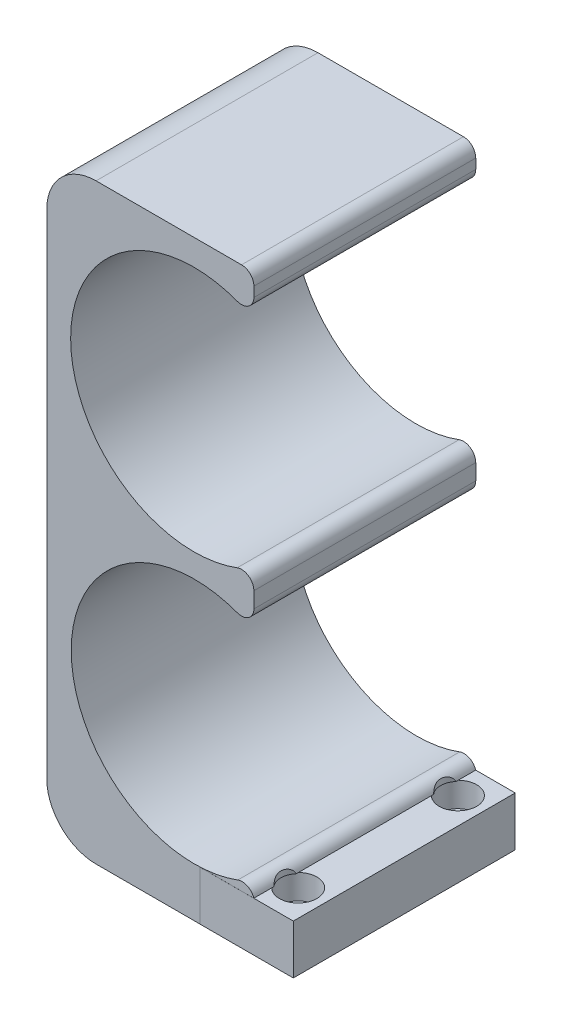
ISO-10303-21;
HEADER;
FILE_DESCRIPTION(('STEP AP214'),'2;1');
FILE_NAME('part.step','',(''),(''),'','','');
FILE_SCHEMA(('AUTOMOTIVE_DESIGN { 1 0 10303 214 1 1 1 1 }'));
ENDSEC;
DATA;
#1=APPLICATION_CONTEXT('core data for automotive mechanical design processes');
#2=APPLICATION_PROTOCOL_DEFINITION('international standard','automotive_design',2000,#1);
#3=PRODUCT_CONTEXT('',#1,'mechanical');
#4=PRODUCT('Part','Part','',(#3));
#5=PRODUCT_RELATED_PRODUCT_CATEGORY('part','',(#4));
#6=PRODUCT_DEFINITION_FORMATION('','',#4);
#7=PRODUCT_DEFINITION_CONTEXT('part definition',#1,'design');
#8=PRODUCT_DEFINITION('design','',#6,#7);
#9=PRODUCT_DEFINITION_SHAPE('','',#8);
#10=(LENGTH_UNIT() NAMED_UNIT(*) SI_UNIT(.MILLI.,.METRE.));
#11=(NAMED_UNIT(*) PLANE_ANGLE_UNIT() SI_UNIT($,.RADIAN.));
#12=(NAMED_UNIT(*) SI_UNIT($,.STERADIAN.) SOLID_ANGLE_UNIT());
#13=UNCERTAINTY_MEASURE_WITH_UNIT(LENGTH_MEASURE(1.E-05),#10,'distance_accuracy_value','');
#14=(GEOMETRIC_REPRESENTATION_CONTEXT(3) GLOBAL_UNCERTAINTY_ASSIGNED_CONTEXT((#13)) GLOBAL_UNIT_ASSIGNED_CONTEXT((#10,
#11,#12)) REPRESENTATION_CONTEXT('',''));
#15=CARTESIAN_POINT('',(0.,0.,0.));
#16=DIRECTION('',(0.,0.,1.));
#17=DIRECTION('',(1.,0.,0.));
#18=AXIS2_PLACEMENT_3D('',#15,#16,#17);
#19=CARTESIAN_POINT('',(-19.494231674002,6.35,-14.3934035007968));
#20=DIRECTION('',(0.,1.,0.));
#21=DIRECTION('',(0.,0.,1.));
#22=AXIS2_PLACEMENT_3D('',#19,#20,#21);
#23=PLANE('',#22);
#24=DIRECTION('',(0.,0.,1.));
#25=VECTOR('',#24,1.);
#26=CARTESIAN_POINT('',(-22.8725122936076,6.35,-14.3934035007968));
#27=LINE('',#26,#25);
#28=CARTESIAN_POINT('',(-22.8725122936076,6.35,-10.9470291660507));
#29=VERTEX_POINT('',#28);
#30=CARTESIAN_POINT('',(-22.8725122936077,6.35,-11.5045897208524));
#31=VERTEX_POINT('',#30);
#32=EDGE_CURVE('E124',#29,#31,#27,.F.);
#33=ORIENTED_EDGE('',*,*,#32,.F.);
#34=CARTESIAN_POINT('',(-19.494231674002,6.35,-14.3934035007968));
#35=DIRECTION('',(0.,-1.,0.));
#36=DIRECTION('',(0.,0.,-1.));
#37=AXIS2_PLACEMENT_3D('',#34,#35,#36);
#38=CIRCLE('',#37,4.826);
#39=CARTESIAN_POINT('',(-22.8725122936076,6.35,-17.8397778355429));
#40=VERTEX_POINT('',#39);
#41=EDGE_CURVE('E431',#29,#40,#38,.T.);
#42=ORIENTED_EDGE('',*,*,#41,.T.);
#43=DIRECTION('',(0.,0.,1.));
#44=VECTOR('',#43,1.);
#45=CARTESIAN_POINT('',(-22.8725122936076,6.35,-14.3934035007968));
#46=LINE('',#45,#44);
#47=CARTESIAN_POINT('',(-22.8725122936077,6.35,-17.2822172807411));
#48=VERTEX_POINT('',#47);
#49=EDGE_CURVE('E118',#48,#40,#46,.F.);
#50=ORIENTED_EDGE('',*,*,#49,.F.);
#51=CARTESIAN_POINT('',(-19.494231674002,6.35,-14.3934035007968));
#52=DIRECTION('',(0.,1.,0.));
#53=DIRECTION('',(0.,0.,1.));
#54=AXIS2_PLACEMENT_3D('',#51,#52,#53);
#55=CIRCLE('',#54,4.445);
#56=EDGE_CURVE('E19',#48,#31,#55,.T.);
#57=ORIENTED_EDGE('',*,*,#56,.T.);
#58=EDGE_LOOP('',(#33,#42,#50,#57));
#59=FACE_BOUND('',#58,.T.);
#60=ADVANCED_FACE('F16',(#59),#23,.F.);
#61=CARTESIAN_POINT('',(-19.494231674002,6.35,-55.5414035007968));
#62=DIRECTION('',(0.,1.,0.));
#63=DIRECTION('',(0.,0.,1.));
#64=AXIS2_PLACEMENT_3D('',#61,#62,#63);
#65=PLANE('',#64);
#66=DIRECTION('',(0.,0.,1.));
#67=VECTOR('',#66,1.);
#68=CARTESIAN_POINT('',(-22.8725122936076,6.35,-55.5414035007968));
#69=LINE('',#68,#67);
#70=CARTESIAN_POINT('',(-22.8725122936076,6.35,-52.0950291660506));
#71=VERTEX_POINT('',#70);
#72=CARTESIAN_POINT('',(-22.8725122936077,6.35,-52.6525897208525));
#73=VERTEX_POINT('',#72);
#74=EDGE_CURVE('E136',#71,#73,#69,.F.);
#75=ORIENTED_EDGE('',*,*,#74,.F.);
#76=CARTESIAN_POINT('',(-19.494231674002,6.35,-55.5414035007968));
#77=DIRECTION('',(0.,-1.,0.));
#78=DIRECTION('',(0.,0.,-1.));
#79=AXIS2_PLACEMENT_3D('',#76,#77,#78);
#80=CIRCLE('',#79,4.826);
#81=CARTESIAN_POINT('',(-22.8725122936076,6.35,-58.9877778355429));
#82=VERTEX_POINT('',#81);
#83=EDGE_CURVE('E436',#71,#82,#80,.T.);
#84=ORIENTED_EDGE('',*,*,#83,.T.);
#85=DIRECTION('',(0.,0.,1.));
#86=VECTOR('',#85,1.);
#87=CARTESIAN_POINT('',(-22.8725122936076,6.35,-55.5414035007968));
#88=LINE('',#87,#86);
#89=CARTESIAN_POINT('',(-22.8725122936077,6.35,-58.4302172807412));
#90=VERTEX_POINT('',#89);
#91=EDGE_CURVE('E132',#90,#82,#88,.F.);
#92=ORIENTED_EDGE('',*,*,#91,.F.);
#93=CARTESIAN_POINT('',(-19.494231674002,6.35,-55.5414035007968));
#94=DIRECTION('',(0.,1.,0.));
#95=DIRECTION('',(0.,0.,1.));
#96=AXIS2_PLACEMENT_3D('',#93,#94,#95);
#97=CIRCLE('',#96,4.445);
#98=EDGE_CURVE('E135',#90,#73,#97,.T.);
#99=ORIENTED_EDGE('',*,*,#98,.T.);
#100=EDGE_LOOP('',(#75,#84,#92,#99));
#101=FACE_BOUND('',#100,.T.);
#102=ADVANCED_FACE('F444',(#101),#65,.F.);
#103=CARTESIAN_POINT('',(-19.494231674002,0.,-55.5414035007968));
#104=DIRECTION('',(0.,1.,0.));
#105=DIRECTION('',(0.,0.,1.));
#106=AXIS2_PLACEMENT_3D('',#103,#104,#105);
#107=PLANE('',#106);
#108=CARTESIAN_POINT('',(-19.494197563237,0.,-55.5413855472897));
#109=DIRECTION('',(0.,-1.,0.));
#110=DIRECTION('',(0.,0.,-1.));
#111=AXIS2_PLACEMENT_3D('',#108,#109,#110);
#112=CIRCLE('',#111,3.1877);
#113=CARTESIAN_POINT('',(-19.494197563237,0.,-58.7290855472897));
#114=VERTEX_POINT('',#113);
#115=EDGE_CURVE('E450',#114,#114,#112,.T.);
#116=ORIENTED_EDGE('',*,*,#115,.T.);
#117=EDGE_LOOP('',(#116));
#118=FACE_BOUND('',#117,.T.);
#119=CARTESIAN_POINT('',(-19.494231674002,0.,-55.5414035007968));
#120=DIRECTION('',(0.,-1.,0.));
#121=DIRECTION('',(0.,0.,-1.));
#122=AXIS2_PLACEMENT_3D('',#119,#120,#121);
#123=CIRCLE('',#122,4.826);
#124=CARTESIAN_POINT('',(-19.494231674002,0.,-60.3674035007968));
#125=VERTEX_POINT('',#124);
#126=EDGE_CURVE('E432',#125,#125,#123,.F.);
#127=ORIENTED_EDGE('',*,*,#126,.T.);
#128=EDGE_LOOP('',(#127));
#129=FACE_BOUND('',#128,.T.);
#130=ADVANCED_FACE('F460',(#118,#129),#107,.T.);
#131=CARTESIAN_POINT('',(-19.494231674002,0.,-14.3934035007968));
#132=DIRECTION('',(0.,1.,0.));
#133=DIRECTION('',(0.,0.,1.));
#134=AXIS2_PLACEMENT_3D('',#131,#132,#133);
#135=PLANE('',#134);
#136=CARTESIAN_POINT('',(-19.494197563237,0.,-14.3933855472898));
#137=DIRECTION('',(0.,-1.,0.));
#138=DIRECTION('',(0.,0.,-1.));
#139=AXIS2_PLACEMENT_3D('',#136,#137,#138);
#140=CIRCLE('',#139,3.1877);
#141=CARTESIAN_POINT('',(-19.494197563237,0.,-17.5810855472898));
#142=VERTEX_POINT('',#141);
#143=EDGE_CURVE('E158',#142,#142,#140,.T.);
#144=ORIENTED_EDGE('',*,*,#143,.T.);
#145=EDGE_LOOP('',(#144));
#146=FACE_BOUND('',#145,.T.);
#147=CARTESIAN_POINT('',(-19.494231674002,0.,-14.3934035007968));
#148=DIRECTION('',(0.,-1.,0.));
#149=DIRECTION('',(0.,0.,-1.));
#150=AXIS2_PLACEMENT_3D('',#147,#148,#149);
#151=CIRCLE('',#150,4.826);
#152=CARTESIAN_POINT('',(-19.494231674002,0.,-19.2194035007968));
#153=VERTEX_POINT('',#152);
#154=EDGE_CURVE('E433',#153,#153,#151,.F.);
#155=ORIENTED_EDGE('',*,*,#154,.T.);
#156=EDGE_LOOP('',(#155));
#157=FACE_BOUND('',#156,.T.);
#158=ADVANCED_FACE('F236',(#146,#157),#135,.T.);
#159=CARTESIAN_POINT('',(-19.494231674002,19.05,-14.3934035007968));
#160=DIRECTION('',(0.,1.,0.));
#161=DIRECTION('',(0.,0.,1.));
#162=AXIS2_PLACEMENT_3D('',#159,#160,#161);
#163=CYLINDRICAL_SURFACE('',#162,4.445);
#164=ORIENTED_EDGE('',*,*,#56,.F.);
#165=CARTESIAN_POINT('',(-22.8725122936077,6.34999999999994,-11.5045897208525));
#166=CARTESIAN_POINT('',(-22.8920451918921,6.41147570182169,-11.5274378372141));
#167=CARTESIAN_POINT('',(-22.9132277684487,6.47152594132509,-11.5526728571365));
#168=CARTESIAN_POINT('',(-22.9583015126842,6.5883353593207,-11.6078117798077));
#169=CARTESIAN_POINT('',(-22.9821911921445,6.64509632038776,-11.6377131206435));
#170=CARTESIAN_POINT('',(-23.0319465584518,6.75459328149273,-11.7018928247726));
#171=CARTESIAN_POINT('',(-23.0577981885288,6.80735333728106,-11.7361410503486));
#172=CARTESIAN_POINT('',(-23.1109770246334,6.90896403797198,-11.8089847774471));
#173=CARTESIAN_POINT('',(-23.1383043299793,6.95781441918892,-11.8475805717667));
#174=CARTESIAN_POINT('',(-23.2214594175863,7.09804991769206,-11.969480061171));
#175=CARTESIAN_POINT('',(-23.2785745275803,7.1833603445574,-12.0590375562628));
#176=CARTESIAN_POINT('',(-23.391225622354,7.3372203885933,-12.252373934328));
#177=CARTESIAN_POINT('',(-23.446759795253,7.4057514086496,-12.3561683996259));
#178=CARTESIAN_POINT('',(-23.5543989681339,7.52960279342919,-12.5798156122773));
#179=CARTESIAN_POINT('',(-23.6062581817026,7.58423853327209,-12.7001631250538));
#180=CARTESIAN_POINT('',(-23.7005221374328,7.67823855188195,-12.9501326289187));
#181=CARTESIAN_POINT('',(-23.7429220711319,7.71759507120917,-13.0797592928835));
#182=CARTESIAN_POINT('',(-23.8225896576431,7.78877747463149,-13.368901802784));
#183=CARTESIAN_POINT('',(-23.8576334777036,7.81805121469415,-13.5296571896206));
#184=CARTESIAN_POINT('',(-23.9097483274717,7.86069960690767,-13.8561891612444));
#185=CARTESIAN_POINT('',(-23.9268088075146,7.87406492720888,-14.0219686347467));
#186=CARTESIAN_POINT('',(-23.9388807399334,7.88351654364624,-14.283135419777));
#187=CARTESIAN_POINT('',(-23.9402202597285,7.88456272383606,-14.3781243571447));
#188=CARTESIAN_POINT('',(-23.9368162228094,7.88190477450004,-14.5679548321959));
#189=CARTESIAN_POINT('',(-23.9320720753788,7.8782001836803,-14.6627963546702));
#190=CARTESIAN_POINT('',(-23.9165540024281,7.86592230892872,-14.8517581416133));
#191=CARTESIAN_POINT('',(-23.9057742574148,7.85734432597895,-14.9458776209718));
#192=CARTESIAN_POINT('',(-23.8783459868438,7.83505592136879,-15.1326413313534));
#193=CARTESIAN_POINT('',(-23.8616978446236,7.82134583494586,-15.2252856583238));
#194=CARTESIAN_POINT('',(-23.8222755857124,7.78794877758394,-15.4109025366153));
#195=CARTESIAN_POINT('',(-23.7993466150719,7.76810883309864,-15.5038149811317));
#196=CARTESIAN_POINT('',(-23.7480383646919,7.72204315139386,-15.686522861017));
#197=CARTESIAN_POINT('',(-23.7196584317083,7.69581664870736,-15.7763179212735));
#198=CARTESIAN_POINT('',(-23.6581649431002,7.63639585076365,-15.9517028430376));
#199=CARTESIAN_POINT('',(-23.6250605557926,7.60321499406476,-16.0373004276869));
#200=CARTESIAN_POINT('',(-23.5550131016321,7.52923576324314,-16.2034348491194));
#201=CARTESIAN_POINT('',(-23.5180717766961,7.48844083915671,-16.2839739559636));
#202=CARTESIAN_POINT('',(-23.4251868864897,7.37949179310147,-16.4720457961898));
#203=CARTESIAN_POINT('',(-23.3678456572501,7.30708199929274,-16.5764841851364));
#204=CARTESIAN_POINT('',(-23.2522613482505,7.14467836900094,-16.7699406802251));
#205=CARTESIAN_POINT('',(-23.194020053176,7.05471602461718,-16.8589858724278));
#206=CARTESIAN_POINT('',(-23.1128985524444,6.91224525134455,-16.9751132005434));
#207=CARTESIAN_POINT('',(-23.0882138596594,6.86640671721727,-17.0093060865139));
#208=CARTESIAN_POINT('',(-23.0402203134458,6.77150633555866,-17.0740013277948));
#209=CARTESIAN_POINT('',(-23.0169112667348,6.72244494290515,-17.104504202198));
#210=CARTESIAN_POINT('',(-22.9720283819479,6.62105992214224,-17.1618494648016));
#211=CARTESIAN_POINT('',(-22.9504648716513,6.56871972793276,-17.1886706390673));
#212=CARTESIAN_POINT('',(-22.9096448488543,6.46131717970363,-17.2384001994919));
#213=CARTESIAN_POINT('',(-22.8903894441342,6.40625353632601,-17.2613067090265));
#214=CARTESIAN_POINT('',(-22.8725122936077,6.34999999999998,-17.2822172807411));
#215=B_SPLINE_CURVE_WITH_KNOTS('',3,(#165,#166,#167,#168,#169,#170,#171,#172,#173,#174,#175,
#176,#177,#178,#179,#180,#181,#182,#183,#184,#185,#186,#187,#188,#189,#190,#191,#192,#193,#194,
#195,#196,#197,#198,#199,#200,#201,#202,#203,#204,#205,#206,#207,#208,#209,#210,#211,#212,#213,
#214),.UNSPECIFIED.,.F.,.F.,(4,2,2,2,2,2,2,2,2,2,2,2,2,2,2,2,2,2,2,2,2,2,2,2,4),(0.,
0.20519962642592,0.410286987530239,0.614023055871277,0.817772853509393,1.2243790393963,
1.631433859486,2.05577541841701,2.48033219506792,2.97976264099546,3.47948590774607,
3.76422866167776,4.04899906586709,4.33404451828015,4.6190713543017,4.91188065444031,
5.20472506680476,5.4970087211866,5.78916025802682,6.2056117747602,6.62132286955846,
6.8080152704668,6.99468137778313,7.18238155273433,7.37017145711238),.UNSPECIFIED.);
#216=EDGE_CURVE('E127',#31,#48,#215,.T.);
#217=ORIENTED_EDGE('',*,*,#216,.F.);
#218=EDGE_LOOP('',(#164,#217));
#219=FACE_BOUND('',#218,.T.);
#220=ADVANCED_FACE('F137',(#219),#163,.F.);
#221=CARTESIAN_POINT('',(-19.494231674002,19.05,-55.5414035007968));
#222=DIRECTION('',(0.,1.,0.));
#223=DIRECTION('',(0.,0.,1.));
#224=AXIS2_PLACEMENT_3D('',#221,#222,#223);
#225=CYLINDRICAL_SURFACE('',#224,4.445);
#226=ORIENTED_EDGE('',*,*,#98,.F.);
#227=CARTESIAN_POINT('',(-22.8725122936077,6.34999999999989,-52.6525897208525));
#228=CARTESIAN_POINT('',(-22.8920451918921,6.41147570182164,-52.6754378372142));
#229=CARTESIAN_POINT('',(-22.9132277684487,6.47152594132504,-52.7006728571366));
#230=CARTESIAN_POINT('',(-22.9583015126842,6.58833535932065,-52.7558117798077));
#231=CARTESIAN_POINT('',(-22.9821911921445,6.64509632038771,-52.7857131206435));
#232=CARTESIAN_POINT('',(-23.0319465584518,6.75459328149268,-52.8498928247726));
#233=CARTESIAN_POINT('',(-23.0577981885288,6.80735333728101,-52.8841410503487));
#234=CARTESIAN_POINT('',(-23.1109770246334,6.90896403797193,-52.9569847774471));
#235=CARTESIAN_POINT('',(-23.1383043299793,6.95781441918888,-52.9955805717667));
#236=CARTESIAN_POINT('',(-23.2214594175863,7.09804991769201,-53.117480061171));
#237=CARTESIAN_POINT('',(-23.2785745275803,7.18336034455735,-53.2070375562628));
#238=CARTESIAN_POINT('',(-23.391225622354,7.33722038859325,-53.4003739343281));
#239=CARTESIAN_POINT('',(-23.446759795253,7.40575140864956,-53.5041683996259));
#240=CARTESIAN_POINT('',(-23.5543989681339,7.52960279342915,-53.7278156122773));
#241=CARTESIAN_POINT('',(-23.6062581817025,7.58423853327206,-53.8481631250538));
#242=CARTESIAN_POINT('',(-23.7005221374327,7.67823855188193,-54.0981326289187));
#243=CARTESIAN_POINT('',(-23.7429220711319,7.71759507120915,-54.2277592928835));
#244=CARTESIAN_POINT('',(-23.8225896576431,7.78877747463148,-54.516901802784));
#245=CARTESIAN_POINT('',(-23.8576334777036,7.81805121469414,-54.6776571896206));
#246=CARTESIAN_POINT('',(-23.9097483274716,7.86069960690766,-55.0041891612444));
#247=CARTESIAN_POINT('',(-23.9268088075146,7.87406492720887,-55.1699686347467));
#248=CARTESIAN_POINT('',(-23.9388807399334,7.88351654364624,-55.431135419777));
#249=CARTESIAN_POINT('',(-23.9402202597285,7.88456272383606,-55.5261243571447));
#250=CARTESIAN_POINT('',(-23.9368162228094,7.88190477450004,-55.7159548321959));
#251=CARTESIAN_POINT('',(-23.9320720753788,7.8782001836803,-55.8107963546702));
#252=CARTESIAN_POINT('',(-23.9165540024281,7.86592230892873,-55.9997581416132));
#253=CARTESIAN_POINT('',(-23.9057742574148,7.85734432597896,-56.0938776209718));
#254=CARTESIAN_POINT('',(-23.8783459868438,7.8350559213688,-56.2806413313534));
#255=CARTESIAN_POINT('',(-23.8616978446236,7.82134583494588,-56.3732856583238));
#256=CARTESIAN_POINT('',(-23.8222755857124,7.78794877758396,-56.5589025366153));
#257=CARTESIAN_POINT('',(-23.799346615072,7.76810883309867,-56.6518149811317));
#258=CARTESIAN_POINT('',(-23.748038364692,7.72204315139389,-56.8345228610169));
#259=CARTESIAN_POINT('',(-23.7196584317083,7.69581664870739,-56.9243179212735));
#260=CARTESIAN_POINT('',(-23.6581649431002,7.63639585076369,-57.0997028430376));
#261=CARTESIAN_POINT('',(-23.6250605557927,7.6032149940648,-57.1853004276869));
#262=CARTESIAN_POINT('',(-23.5550131016321,7.52923576324318,-57.3514348491194));
#263=CARTESIAN_POINT('',(-23.5180717766961,7.48844083915675,-57.4319739559636));
#264=CARTESIAN_POINT('',(-23.4251868864898,7.37949179310152,-57.6200457961898));
#265=CARTESIAN_POINT('',(-23.3678456572501,7.3070819992928,-57.7244841851364));
#266=CARTESIAN_POINT('',(-23.2522613482505,7.144678369001,-57.9179406802251));
#267=CARTESIAN_POINT('',(-23.1940200531761,7.05471602461724,-58.0069858724278));
#268=CARTESIAN_POINT('',(-23.1128985524444,6.91224525134461,-58.1231132005435));
#269=CARTESIAN_POINT('',(-23.0882138596595,6.86640671721734,-58.157306086514));
#270=CARTESIAN_POINT('',(-23.0402203134459,6.77150633555872,-58.2220013277949));
#271=CARTESIAN_POINT('',(-23.0169112667348,6.7224449429052,-58.2525042021981));
#272=CARTESIAN_POINT('',(-22.9720283819479,6.62105992214228,-58.3098494648017));
#273=CARTESIAN_POINT('',(-22.9504648716513,6.5687197279328,-58.3366706390674));
#274=CARTESIAN_POINT('',(-22.9096448488544,6.46131717970367,-58.386400199492));
#275=CARTESIAN_POINT('',(-22.8903894441343,6.40625353632604,-58.4093067090265));
#276=CARTESIAN_POINT('',(-22.8725122936077,6.35000000000001,-58.4302172807412));
#277=B_SPLINE_CURVE_WITH_KNOTS('',3,(#227,#228,#229,#230,#231,#232,#233,#234,#235,#236,#237,
#238,#239,#240,#241,#242,#243,#244,#245,#246,#247,#248,#249,#250,#251,#252,#253,#254,#255,#256,
#257,#258,#259,#260,#261,#262,#263,#264,#265,#266,#267,#268,#269,#270,#271,#272,#273,#274,#275,
#276),.UNSPECIFIED.,.F.,.F.,(4,2,2,2,2,2,2,2,2,2,2,2,2,2,2,2,2,2,2,2,2,2,2,2,4),(0.,
0.205199626425919,0.410286987530235,0.61402305587127,0.817772853509385,1.22437903939629,
1.63143385948597,2.05577541841699,2.48033219506789,2.97976264099542,3.47948590774603,
3.76422866167772,4.04899906586705,4.33404451828011,4.61907135430166,4.91188065444026,
5.20472506680472,5.49700872118656,5.78916025802677,6.20561177476016,6.62132286955843,
6.80801527046677,6.99468137778313,7.18238155273434,7.37017145711241),.UNSPECIFIED.);
#278=EDGE_CURVE('E138',#73,#90,#277,.T.);
#279=ORIENTED_EDGE('',*,*,#278,.F.);
#280=EDGE_LOOP('',(#226,#279));
#281=FACE_BOUND('',#280,.T.);
#282=ADVANCED_FACE('F227',(#281),#225,.F.);
#283=CARTESIAN_POINT('',(-19.494231674002,6.35,-14.3934035007968));
#284=DIRECTION('',(0.,-1.,0.));
#285=DIRECTION('',(0.,0.,-1.));
#286=AXIS2_PLACEMENT_3D('',#283,#284,#285);
#287=CYLINDRICAL_SURFACE('',#286,4.826);
#288=ORIENTED_EDGE('',*,*,#41,.F.);
#289=CARTESIAN_POINT('',(-19.494231674002,6.35,-14.3934035007968));
#290=DIRECTION('',(0.,-1.,0.));
#291=DIRECTION('',(0.,0.,-1.));
#292=AXIS2_PLACEMENT_3D('',#289,#290,#291);
#293=CIRCLE('',#292,4.826);
#294=EDGE_CURVE('E307',#40,#29,#293,.T.);
#295=ORIENTED_EDGE('',*,*,#294,.F.);
#296=EDGE_LOOP('',(#288,#295));
#297=FACE_BOUND('',#296,.T.);
#298=ORIENTED_EDGE('',*,*,#154,.F.);
#299=EDGE_LOOP('',(#298));
#300=FACE_BOUND('',#299,.T.);
#301=ADVANCED_FACE('F224',(#297,#300),#287,.F.);
#302=CARTESIAN_POINT('',(-19.494231674002,6.35,-55.5414035007968));
#303=DIRECTION('',(0.,-1.,0.));
#304=DIRECTION('',(0.,0.,-1.));
#305=AXIS2_PLACEMENT_3D('',#302,#303,#304);
#306=CYLINDRICAL_SURFACE('',#305,4.826);
#307=ORIENTED_EDGE('',*,*,#83,.F.);
#308=CARTESIAN_POINT('',(-19.494231674002,6.35,-55.5414035007968));
#309=DIRECTION('',(0.,-1.,0.));
#310=DIRECTION('',(0.,0.,-1.));
#311=AXIS2_PLACEMENT_3D('',#308,#309,#310);
#312=CIRCLE('',#311,4.826);
#313=EDGE_CURVE('E293',#82,#71,#312,.T.);
#314=ORIENTED_EDGE('',*,*,#313,.F.);
#315=EDGE_LOOP('',(#307,#314));
#316=FACE_BOUND('',#315,.T.);
#317=ORIENTED_EDGE('',*,*,#126,.F.);
#318=EDGE_LOOP('',(#317));
#319=FACE_BOUND('',#318,.T.);
#320=ADVANCED_FACE('F220',(#316,#319),#306,.F.);
#321=CARTESIAN_POINT('',(-36.7569578851396,0.,-6.33963321733864));
#322=DIRECTION('',(0.,0.,1.));
#323=DIRECTION('',(1.,0.,0.));
#324=AXIS2_PLACEMENT_3D('',#321,#322,#323);
#325=PLANE('',#324);
#326=DIRECTION('',(1.,0.,0.));
#327=VECTOR('',#326,1.);
#328=CARTESIAN_POINT('',(-46.7432138959382,6.35,-6.33963321733864));
#329=LINE('',#328,#327);
#330=CARTESIAN_POINT('',(-36.7569578851396,6.35,-6.33963321733864));
#331=VERTEX_POINT('',#330);
#332=CARTESIAN_POINT('',(-12.6926217043867,6.35,-6.33963321733864));
#333=VERTEX_POINT('',#332);
#334=EDGE_CURVE('E304',#331,#333,#329,.T.);
#335=ORIENTED_EDGE('',*,*,#334,.F.);
#336=DIRECTION('',(0.,1.,0.));
#337=VECTOR('',#336,1.);
#338=CARTESIAN_POINT('',(-36.7569578851396,0.,-6.33963321733864));
#339=LINE('',#338,#337);
#340=CARTESIAN_POINT('',(-36.7569578851396,-6.35,-6.33963321733864));
#341=VERTEX_POINT('',#340);
#342=EDGE_CURVE('E323',#341,#331,#339,.T.);
#343=ORIENTED_EDGE('',*,*,#342,.F.);
#344=DIRECTION('',(1.,0.,0.));
#345=VECTOR('',#344,1.);
#346=CARTESIAN_POINT('',(-46.7432138959382,-6.35,-6.33963321733864));
#347=LINE('',#346,#345);
#348=CARTESIAN_POINT('',(-12.6926217043867,-6.35,-6.33963321733864));
#349=VERTEX_POINT('',#348);
#350=EDGE_CURVE('E345',#341,#349,#347,.T.);
#351=ORIENTED_EDGE('',*,*,#350,.T.);
#352=DIRECTION('',(0.,1.,0.));
#353=VECTOR('',#352,1.);
#354=CARTESIAN_POINT('',(-12.6926217043867,0.,-6.33963321733864));
#355=LINE('',#354,#353);
#356=EDGE_CURVE('E278',#333,#349,#355,.F.);
#357=ORIENTED_EDGE('',*,*,#356,.F.);
#358=EDGE_LOOP('',(#335,#343,#351,#357));
#359=FACE_BOUND('',#358,.T.);
#360=ADVANCED_FACE('F216',(#359),#325,.T.);
#361=CARTESIAN_POINT('',(-19.494197563237,6.35,-55.5413855472897));
#362=DIRECTION('',(0.,-1.,0.));
#363=DIRECTION('',(0.,0.,-1.));
#364=AXIS2_PLACEMENT_3D('',#361,#362,#363);
#365=CYLINDRICAL_SURFACE('',#364,3.1877);
#366=CARTESIAN_POINT('',(-19.494197563237,-6.35,-55.5413855472897));
#367=DIRECTION('',(0.,-1.,0.));
#368=DIRECTION('',(0.,0.,-1.));
#369=AXIS2_PLACEMENT_3D('',#366,#367,#368);
#370=CIRCLE('',#369,3.1877);
#371=CARTESIAN_POINT('',(-19.494197563237,-6.35,-58.7290855472897));
#372=VERTEX_POINT('',#371);
#373=EDGE_CURVE('E423',#372,#372,#370,.T.);
#374=ORIENTED_EDGE('',*,*,#373,.T.);
#375=EDGE_LOOP('',(#374));
#376=FACE_BOUND('',#375,.T.);
#377=ORIENTED_EDGE('',*,*,#115,.F.);
#378=EDGE_LOOP('',(#377));
#379=FACE_BOUND('',#378,.T.);
#380=ADVANCED_FACE('F212',(#376,#379),#365,.F.);
#381=CARTESIAN_POINT('',(-19.494197563237,6.35,-14.3933855472898));
#382=DIRECTION('',(0.,-1.,0.));
#383=DIRECTION('',(0.,0.,-1.));
#384=AXIS2_PLACEMENT_3D('',#381,#382,#383);
#385=CYLINDRICAL_SURFACE('',#384,3.1877);
#386=CARTESIAN_POINT('',(-19.494197563237,-6.35,-14.3933855472898));
#387=DIRECTION('',(0.,-1.,0.));
#388=DIRECTION('',(0.,0.,-1.));
#389=AXIS2_PLACEMENT_3D('',#386,#387,#388);
#390=CIRCLE('',#389,3.1877);
#391=CARTESIAN_POINT('',(-19.494197563237,-6.35,-17.5810855472898));
#392=VERTEX_POINT('',#391);
#393=EDGE_CURVE('E331',#392,#392,#390,.T.);
#394=ORIENTED_EDGE('',*,*,#393,.T.);
#395=EDGE_LOOP('',(#394));
#396=FACE_BOUND('',#395,.T.);
#397=ORIENTED_EDGE('',*,*,#143,.F.);
#398=EDGE_LOOP('',(#397));
#399=FACE_BOUND('',#398,.T.);
#400=ADVANCED_FACE('F208',(#396,#399),#385,.F.);
#401=CARTESIAN_POINT('',(-36.7569578851396,0.,0.));
#402=DIRECTION('',(-1.,0.,0.));
#403=DIRECTION('',(0.,0.,1.));
#404=AXIS2_PLACEMENT_3D('',#401,#402,#403);
#405=PLANE('',#404);
#406=DIRECTION('',(0.,0.,1.));
#407=VECTOR('',#406,1.);
#408=CARTESIAN_POINT('',(-36.7569578851396,6.35,-38.2400243094382));
#409=LINE('',#408,#407);
#410=CARTESIAN_POINT('',(-36.7569578851396,6.35,-6.35));
#411=VERTEX_POINT('',#410);
#412=EDGE_CURVE('E306',#411,#331,#409,.T.);
#413=ORIENTED_EDGE('',*,*,#412,.F.);
#414=DIRECTION('',(0.,1.,0.));
#415=VECTOR('',#414,1.);
#416=CARTESIAN_POINT('',(-36.7569578851396,80.4570981120867,-6.35));
#417=LINE('',#416,#415);
#418=CARTESIAN_POINT('',(-36.7569578851396,-6.35,-6.35));
#419=VERTEX_POINT('',#418);
#420=EDGE_CURVE('E336',#419,#411,#417,.T.);
#421=ORIENTED_EDGE('',*,*,#420,.F.);
#422=DIRECTION('',(0.,0.,1.));
#423=VECTOR('',#422,1.);
#424=CARTESIAN_POINT('',(-36.7569578851396,-6.35,-38.2400243094382));
#425=LINE('',#424,#423);
#426=EDGE_CURVE('E290',#419,#341,#425,.T.);
#427=ORIENTED_EDGE('',*,*,#426,.T.);
#428=ORIENTED_EDGE('',*,*,#342,.T.);
#429=EDGE_LOOP('',(#413,#421,#427,#428));
#430=FACE_BOUND('',#429,.T.);
#431=ADVANCED_FACE('F204',(#430),#405,.T.);
#432=CARTESIAN_POINT('',(-76.2,146.05,0.));
#433=DIRECTION('',(0.,1.,0.));
#434=DIRECTION('',(0.,0.,1.));
#435=AXIS2_PLACEMENT_3D('',#432,#433,#434);
#436=PLANE('',#435);
#437=DIRECTION('',(0.,0.,-1.));
#438=VECTOR('',#437,1.);
#439=CARTESIAN_POINT('',(-26.035,146.05,0.));
#440=LINE('',#439,#438);
#441=CARTESIAN_POINT('',(-26.035,146.05,-63.5000000061439));
#442=VERTEX_POINT('',#441);
#443=CARTESIAN_POINT('',(-26.035,146.05,-6.35));
#444=VERTEX_POINT('',#443);
#445=EDGE_CURVE('E321',#442,#444,#440,.F.);
#446=ORIENTED_EDGE('',*,*,#445,.F.);
#447=DIRECTION('',(-1.,0.,0.));
#448=VECTOR('',#447,1.);
#449=CARTESIAN_POINT('',(-21.7096217043867,146.05,-63.5000000122878));
#450=LINE('',#449,#448);
#451=CARTESIAN_POINT('',(-63.5,146.05,-63.5000000061439));
#452=VERTEX_POINT('',#451);
#453=EDGE_CURVE('E389',#452,#442,#450,.F.);
#454=ORIENTED_EDGE('',*,*,#453,.F.);
#455=DIRECTION('',(0.,0.,-1.));
#456=VECTOR('',#455,1.);
#457=CARTESIAN_POINT('',(-63.5,146.05,0.));
#458=LINE('',#457,#456);
#459=CARTESIAN_POINT('',(-63.5,146.05,-6.35));
#460=VERTEX_POINT('',#459);
#461=EDGE_CURVE('E324',#460,#452,#458,.T.);
#462=ORIENTED_EDGE('',*,*,#461,.F.);
#463=DIRECTION('',(1.,0.,0.));
#464=VECTOR('',#463,1.);
#465=CARTESIAN_POINT('',(-58.5882128881687,146.05,-6.35));
#466=LINE('',#465,#464);
#467=EDGE_CURVE('E395',#444,#460,#466,.F.);
#468=ORIENTED_EDGE('',*,*,#467,.F.);
#469=EDGE_LOOP('',(#446,#454,#462,#468));
#470=FACE_BOUND('',#469,.T.);
#471=ADVANCED_FACE('F200',(#470),#436,.T.);
#472=CARTESIAN_POINT('',(-26.035,142.875,0.));
#473=DIRECTION('',(0.,0.,-1.));
#474=DIRECTION('',(-1.,0.,0.));
#475=AXIS2_PLACEMENT_3D('',#472,#473,#474);
#476=CYLINDRICAL_SURFACE('',#475,3.175);
#477=CARTESIAN_POINT('',(-26.035,142.875,-6.35));
#478=DIRECTION('',(0.,0.,-1.));
#479=DIRECTION('',(-1.,0.,0.));
#480=AXIS2_PLACEMENT_3D('',#477,#478,#479);
#481=CIRCLE('',#480,3.175);
#482=CARTESIAN_POINT('',(-22.86,142.875,-6.35));
#483=VERTEX_POINT('',#482);
#484=EDGE_CURVE('E396',#483,#444,#481,.F.);
#485=ORIENTED_EDGE('',*,*,#484,.F.);
#486=DIRECTION('',(0.,0.,1.));
#487=VECTOR('',#486,1.);
#488=CARTESIAN_POINT('',(-22.86,142.875,0.));
#489=LINE('',#488,#487);
#490=CARTESIAN_POINT('',(-22.86,142.875,-63.5000000061439));
#491=VERTEX_POINT('',#490);
#492=EDGE_CURVE('E319',#491,#483,#489,.T.);
#493=ORIENTED_EDGE('',*,*,#492,.F.);
#494=CARTESIAN_POINT('',(-26.035,142.875,-63.5));
#495=DIRECTION('',(0.,0.,-1.));
#496=DIRECTION('',(-1.,0.,0.));
#497=AXIS2_PLACEMENT_3D('',#494,#495,#496);
#498=CIRCLE('',#497,3.175);
#499=EDGE_CURVE('E386',#442,#491,#498,.T.);
#500=ORIENTED_EDGE('',*,*,#499,.F.);
#501=ORIENTED_EDGE('',*,*,#445,.T.);
#502=EDGE_LOOP('',(#485,#493,#500,#501));
#503=FACE_BOUND('',#502,.T.);
#504=ADVANCED_FACE('F196',(#503),#476,.T.);
#505=CARTESIAN_POINT('',(-22.86,146.05,0.));
#506=DIRECTION('',(1.,0.,0.));
#507=DIRECTION('',(0.,1.,0.));
#508=AXIS2_PLACEMENT_3D('',#505,#506,#507);
#509=PLANE('',#508);
#510=DIRECTION('',(0.,0.,-1.));
#511=VECTOR('',#510,1.);
#512=CARTESIAN_POINT('',(-22.86,140.342875673139,0.));
#513=LINE('',#512,#511);
#514=CARTESIAN_POINT('',(-22.86,140.342875673139,-63.5000000061439));
#515=VERTEX_POINT('',#514);
#516=CARTESIAN_POINT('',(-22.86,140.342875673139,-6.35));
#517=VERTEX_POINT('',#516);
#518=EDGE_CURVE('E317',#515,#517,#513,.F.);
#519=ORIENTED_EDGE('',*,*,#518,.F.);
#520=DIRECTION('',(0.,1.,0.));
#521=VECTOR('',#520,1.);
#522=CARTESIAN_POINT('',(-22.86,0.,-63.5000000122878));
#523=LINE('',#522,#521);
#524=EDGE_CURVE('E385',#491,#515,#523,.F.);
#525=ORIENTED_EDGE('',*,*,#524,.F.);
#526=ORIENTED_EDGE('',*,*,#492,.T.);
#527=DIRECTION('',(0.,1.,0.));
#528=VECTOR('',#527,1.);
#529=CARTESIAN_POINT('',(-22.86,80.4570981120867,-6.35));
#530=LINE('',#529,#528);
#531=EDGE_CURVE('E399',#517,#483,#530,.T.);
#532=ORIENTED_EDGE('',*,*,#531,.F.);
#533=EDGE_LOOP('',(#519,#525,#526,#532));
#534=FACE_BOUND('',#533,.T.);
#535=ADVANCED_FACE('F192',(#534),#509,.T.);
#536=CARTESIAN_POINT('',(-26.035,140.342875673139,0.));
#537=DIRECTION('',(0.,0.,-1.));
#538=DIRECTION('',(-1.,0.,0.));
#539=AXIS2_PLACEMENT_3D('',#536,#537,#538);
#540=CYLINDRICAL_SURFACE('',#539,3.175);
#541=CARTESIAN_POINT('',(-26.035,140.342875673139,-6.35));
#542=DIRECTION('',(0.,0.,-1.));
#543=DIRECTION('',(-1.,0.,0.));
#544=AXIS2_PLACEMENT_3D('',#541,#542,#543);
#545=CIRCLE('',#544,3.175);
#546=CARTESIAN_POINT('',(-27.149759129249,137.370008860825,-6.35));
#547=VERTEX_POINT('',#546);
#548=EDGE_CURVE('E400',#547,#517,#545,.F.);
#549=ORIENTED_EDGE('',*,*,#548,.F.);
#550=DIRECTION('',(0.,0.,-1.));
#551=VECTOR('',#550,1.);
#552=CARTESIAN_POINT('',(-27.149759129249,137.370008860825,0.));
#553=LINE('',#552,#551);
#554=CARTESIAN_POINT('',(-27.149759129249,137.370008860825,-63.5));
#555=VERTEX_POINT('',#554);
#556=EDGE_CURVE('E314',#547,#555,#553,.T.);
#557=ORIENTED_EDGE('',*,*,#556,.T.);
#558=CARTESIAN_POINT('',(-26.035,140.342875673139,-63.5));
#559=DIRECTION('',(0.,0.,-1.));
#560=DIRECTION('',(-1.,0.,0.));
#561=AXIS2_PLACEMENT_3D('',#558,#559,#560);
#562=CIRCLE('',#561,3.175);
#563=EDGE_CURVE('E382',#515,#555,#562,.T.);
#564=ORIENTED_EDGE('',*,*,#563,.F.);
#565=ORIENTED_EDGE('',*,*,#518,.T.);
#566=EDGE_LOOP('',(#549,#557,#564,#565));
#567=FACE_BOUND('',#566,.T.);
#568=ADVANCED_FACE('F188',(#567),#540,.T.);
#569=CARTESIAN_POINT('',(-38.2973504217388,107.641340737689,0.));
#570=DIRECTION('',(0.,0.,-1.));
#571=DIRECTION('',(-1.,0.,0.));
#572=AXIS2_PLACEMENT_3D('',#569,#570,#571);
#573=CYLINDRICAL_SURFACE('',#572,31.75);
#574=CARTESIAN_POINT('',(-38.2973504217388,107.641340737689,-63.5));
#575=DIRECTION('',(0.,0.,-1.));
#576=DIRECTION('',(-1.,0.,0.));
#577=AXIS2_PLACEMENT_3D('',#574,#575,#576);
#578=CIRCLE('',#577,31.75);
#579=CARTESIAN_POINT('',(-27.149759129249,77.9126726145519,-63.5));
#580=VERTEX_POINT('',#579);
#581=EDGE_CURVE('E379',#555,#580,#578,.F.);
#582=ORIENTED_EDGE('',*,*,#581,.F.);
#583=ORIENTED_EDGE('',*,*,#556,.F.);
#584=CARTESIAN_POINT('',(-38.2973504217388,107.641340737689,-6.35));
#585=DIRECTION('',(0.,0.,-1.));
#586=DIRECTION('',(-1.,0.,0.));
#587=AXIS2_PLACEMENT_3D('',#584,#585,#586);
#588=CIRCLE('',#587,31.75);
#589=CARTESIAN_POINT('',(-27.149759129249,77.9126726145519,-6.35));
#590=VERTEX_POINT('',#589);
#591=EDGE_CURVE('E403',#590,#547,#588,.T.);
#592=ORIENTED_EDGE('',*,*,#591,.F.);
#593=DIRECTION('',(0.,0.,-1.));
#594=VECTOR('',#593,1.);
#595=CARTESIAN_POINT('',(-27.1497591292489,77.9126726145519,0.));
#596=LINE('',#595,#594);
#597=EDGE_CURVE('E312',#580,#590,#596,.F.);
#598=ORIENTED_EDGE('',*,*,#597,.F.);
#599=EDGE_LOOP('',(#582,#583,#592,#598));
#600=FACE_BOUND('',#599,.T.);
#601=ADVANCED_FACE('F184',(#600),#573,.F.);
#602=CARTESIAN_POINT('',(-26.035,74.9398058022382,0.));
#603=DIRECTION('',(0.,0.,-1.));
#604=DIRECTION('',(-1.,0.,0.));
#605=AXIS2_PLACEMENT_3D('',#602,#603,#604);
#606=CYLINDRICAL_SURFACE('',#605,3.175);
#607=CARTESIAN_POINT('',(-26.035,74.9398058022382,-6.35));
#608=DIRECTION('',(0.,0.,-1.));
#609=DIRECTION('',(-1.,0.,0.));
#610=AXIS2_PLACEMENT_3D('',#607,#608,#609);
#611=CIRCLE('',#610,3.175);
#612=CARTESIAN_POINT('',(-22.86,74.9398058022382,-6.35));
#613=VERTEX_POINT('',#612);
#614=EDGE_CURVE('E406',#613,#590,#611,.F.);
#615=ORIENTED_EDGE('',*,*,#614,.F.);
#616=DIRECTION('',(0.,0.,-1.));
#617=VECTOR('',#616,1.);
#618=CARTESIAN_POINT('',(-22.86,74.9398058022382,0.));
#619=LINE('',#618,#617);
#620=CARTESIAN_POINT('',(-22.86,74.9398058022382,-63.5000000061439));
#621=VERTEX_POINT('',#620);
#622=EDGE_CURVE('E310',#621,#613,#619,.F.);
#623=ORIENTED_EDGE('',*,*,#622,.F.);
#624=CARTESIAN_POINT('',(-26.035,74.9398058022382,-63.5));
#625=DIRECTION('',(0.,0.,-1.));
#626=DIRECTION('',(-1.,0.,0.));
#627=AXIS2_PLACEMENT_3D('',#624,#625,#626);
#628=CIRCLE('',#627,3.175);
#629=EDGE_CURVE('E376',#580,#621,#628,.T.);
#630=ORIENTED_EDGE('',*,*,#629,.F.);
#631=ORIENTED_EDGE('',*,*,#597,.T.);
#632=EDGE_LOOP('',(#615,#623,#630,#631));
#633=FACE_BOUND('',#632,.T.);
#634=ADVANCED_FACE('F180',(#633),#606,.T.);
#635=CARTESIAN_POINT('',(-22.86,79.8969591090337,0.));
#636=DIRECTION('',(1.,0.,0.));
#637=DIRECTION('',(0.,0.,-1.));
#638=AXIS2_PLACEMENT_3D('',#635,#636,#637);
#639=PLANE('',#638);
#640=ORIENTED_EDGE('',*,*,#622,.T.);
#641=DIRECTION('',(0.,1.,0.));
#642=VECTOR('',#641,1.);
#643=CARTESIAN_POINT('',(-22.86,80.4570981120867,-6.35));
#644=LINE('',#643,#642);
#645=CARTESIAN_POINT('',(-22.86,70.8763561316517,-6.35));
#646=VERTEX_POINT('',#645);
#647=EDGE_CURVE('E409',#646,#613,#644,.T.);
#648=ORIENTED_EDGE('',*,*,#647,.F.);
#649=DIRECTION('',(0.,0.,-1.));
#650=VECTOR('',#649,1.);
#651=CARTESIAN_POINT('',(-22.86,70.8763561316517,0.));
#652=LINE('',#651,#650);
#653=CARTESIAN_POINT('',(-22.86,70.8763561316517,-63.5000000061439));
#654=VERTEX_POINT('',#653);
#655=EDGE_CURVE('E145',#654,#646,#652,.F.);
#656=ORIENTED_EDGE('',*,*,#655,.F.);
#657=DIRECTION('',(0.,1.,0.));
#658=VECTOR('',#657,1.);
#659=CARTESIAN_POINT('',(-22.86,0.,-63.5000000122878));
#660=LINE('',#659,#658);
#661=EDGE_CURVE('E375',#621,#654,#660,.F.);
#662=ORIENTED_EDGE('',*,*,#661,.F.);
#663=EDGE_LOOP('',(#640,#648,#656,#662));
#664=FACE_BOUND('',#663,.T.);
#665=ADVANCED_FACE('F176',(#664),#639,.T.);
#666=CARTESIAN_POINT('',(-26.035,70.8763561316517,0.));
#667=DIRECTION('',(0.,0.,-1.));
#668=DIRECTION('',(-1.,0.,0.));
#669=AXIS2_PLACEMENT_3D('',#666,#667,#668);
#670=CYLINDRICAL_SURFACE('',#669,3.175);
#671=CARTESIAN_POINT('',(-26.035,70.8763561316517,-6.35));
#672=DIRECTION('',(0.,0.,-1.));
#673=DIRECTION('',(-1.,0.,0.));
#674=AXIS2_PLACEMENT_3D('',#671,#672,#673);
#675=CIRCLE('',#674,3.175);
#676=CARTESIAN_POINT('',(-27.1342086683981,67.8977045401898,-6.35));
#677=VERTEX_POINT('',#676);
#678=EDGE_CURVE('E410',#677,#646,#675,.F.);
#679=ORIENTED_EDGE('',*,*,#678,.F.);
#680=DIRECTION('',(0.,0.,-1.));
#681=VECTOR('',#680,1.);
#682=CARTESIAN_POINT('',(-27.1342086683982,67.8977045401898,0.));
#683=LINE('',#682,#681);
#684=CARTESIAN_POINT('',(-27.1342086683981,67.8977045401898,-63.5));
#685=VERTEX_POINT('',#684);
#686=EDGE_CURVE('E139',#677,#685,#683,.T.);
#687=ORIENTED_EDGE('',*,*,#686,.T.);
#688=CARTESIAN_POINT('',(-26.035,70.8763561316517,-63.5));
#689=DIRECTION('',(0.,0.,-1.));
#690=DIRECTION('',(-1.,0.,0.));
#691=AXIS2_PLACEMENT_3D('',#688,#689,#690);
#692=CIRCLE('',#691,3.175);
#693=EDGE_CURVE('E372',#654,#685,#692,.T.);
#694=ORIENTED_EDGE('',*,*,#693,.F.);
#695=ORIENTED_EDGE('',*,*,#655,.T.);
#696=EDGE_LOOP('',(#679,#687,#694,#695));
#697=FACE_BOUND('',#696,.T.);
#698=ADVANCED_FACE('F172',(#697),#670,.T.);
#699=CARTESIAN_POINT('',(-38.1304242791221,38.1,0.));
#700=DIRECTION('',(0.,0.,-1.));
#701=DIRECTION('',(-1.,0.,0.));
#702=AXIS2_PLACEMENT_3D('',#699,#700,#701);
#703=CYLINDRICAL_SURFACE('',#702,31.7619261636);
#704=CARTESIAN_POINT('',(-38.1304242791221,38.1,-6.35));
#705=DIRECTION('',(0.,0.,-1.));
#706=DIRECTION('',(-1.,0.,0.));
#707=AXIS2_PLACEMENT_3D('',#704,#705,#706);
#708=CIRCLE('',#707,31.7619261636);
#709=CARTESIAN_POINT('',(-26.9957143975725,8.35377016367119,-6.35));
#710=VERTEX_POINT('',#709);
#711=EDGE_CURVE('E413',#710,#677,#708,.T.);
#712=ORIENTED_EDGE('',*,*,#711,.F.);
#713=DIRECTION('',(0.,0.,-1.));
#714=VECTOR('',#713,1.);
#715=CARTESIAN_POINT('',(-26.9957143975725,8.35377016367122,0.));
#716=LINE('',#715,#714);
#717=CARTESIAN_POINT('',(-26.9957143975725,8.35377016367121,-63.5));
#718=VERTEX_POINT('',#717);
#719=EDGE_CURVE('E142',#718,#710,#716,.F.);
#720=ORIENTED_EDGE('',*,*,#719,.F.);
#721=CARTESIAN_POINT('',(-38.1304242791221,38.1,-63.5));
#722=DIRECTION('',(0.,0.,-1.));
#723=DIRECTION('',(-1.,0.,0.));
#724=AXIS2_PLACEMENT_3D('',#721,#722,#723);
#725=CIRCLE('',#724,31.7619261636);
#726=EDGE_CURVE('E369',#685,#718,#725,.F.);
#727=ORIENTED_EDGE('',*,*,#726,.F.);
#728=ORIENTED_EDGE('',*,*,#686,.F.);
#729=EDGE_LOOP('',(#712,#720,#727,#728));
#730=FACE_BOUND('',#729,.T.);
#731=ADVANCED_FACE('F167',(#730),#703,.F.);
#732=CARTESIAN_POINT('',(-25.8868424317849,5.39143340732353,0.));
#733=DIRECTION('',(0.,0.,-1.));
#734=DIRECTION('',(-1.,0.,0.));
#735=AXIS2_PLACEMENT_3D('',#732,#733,#734);
#736=CYLINDRICAL_SURFACE('',#735,3.1630738364);
#737=DIRECTION('',(0.,0.,1.));
#738=VECTOR('',#737,1.);
#739=CARTESIAN_POINT('',(-22.8725122936076,6.35,-38.2400243094382));
#740=LINE('',#739,#738);
#741=CARTESIAN_POINT('',(-22.8725122936077,6.35,-6.35));
#742=VERTEX_POINT('',#741);
#743=EDGE_CURVE('E129',#29,#742,#740,.T.);
#744=ORIENTED_EDGE('',*,*,#743,.F.);
#745=ORIENTED_EDGE('',*,*,#32,.T.);
#746=ORIENTED_EDGE('',*,*,#216,.T.);
#747=ORIENTED_EDGE('',*,*,#49,.T.);
#748=DIRECTION('',(0.,0.,1.));
#749=VECTOR('',#748,1.);
#750=CARTESIAN_POINT('',(-22.8725122936076,6.35,-38.2400243094382));
#751=LINE('',#750,#749);
#752=EDGE_CURVE('E288',#71,#40,#751,.T.);
#753=ORIENTED_EDGE('',*,*,#752,.F.);
#754=ORIENTED_EDGE('',*,*,#74,.T.);
#755=ORIENTED_EDGE('',*,*,#278,.T.);
#756=ORIENTED_EDGE('',*,*,#91,.T.);
#757=DIRECTION('',(0.,0.,1.));
#758=VECTOR('',#757,1.);
#759=CARTESIAN_POINT('',(-22.8725122936076,6.35,-38.2400243094382));
#760=LINE('',#759,#758);
#761=CARTESIAN_POINT('',(-22.8725122936077,6.34999999999998,-63.5000000061439));
#762=VERTEX_POINT('',#761);
#763=EDGE_CURVE('E301',#762,#82,#760,.T.);
#764=ORIENTED_EDGE('',*,*,#763,.F.);
#765=CARTESIAN_POINT('',(-25.8868424317849,5.39143340732353,-63.5));
#766=DIRECTION('',(0.,0.,-1.));
#767=DIRECTION('',(-1.,0.,0.));
#768=AXIS2_PLACEMENT_3D('',#765,#766,#767);
#769=CIRCLE('',#768,3.1630738364);
#770=EDGE_CURVE('E365',#718,#762,#769,.T.);
#771=ORIENTED_EDGE('',*,*,#770,.F.);
#772=ORIENTED_EDGE('',*,*,#719,.T.);
#773=CARTESIAN_POINT('',(-25.8868424317849,5.39143340732353,-6.35));
#774=DIRECTION('',(0.,0.,-1.));
#775=DIRECTION('',(-1.,0.,0.));
#776=AXIS2_PLACEMENT_3D('',#773,#774,#775);
#777=CIRCLE('',#776,3.1630738364);
#778=EDGE_CURVE('E416',#742,#710,#777,.F.);
#779=ORIENTED_EDGE('',*,*,#778,.F.);
#780=EDGE_LOOP('',(#744,#745,#746,#747,#753,#754,#755,#756,#764,#771,#772,#779));
#781=FACE_BOUND('',#780,.T.);
#782=ADVANCED_FACE('F125',(#781),#736,.T.);
#783=CARTESIAN_POINT('',(-46.7432138959382,6.35,-38.2400243094382));
#784=DIRECTION('',(0.,1.,0.));
#785=DIRECTION('',(0.,0.,1.));
#786=AXIS2_PLACEMENT_3D('',#783,#784,#785);
#787=PLANE('',#786);
#788=ORIENTED_EDGE('',*,*,#313,.T.);
#789=ORIENTED_EDGE('',*,*,#752,.T.);
#790=ORIENTED_EDGE('',*,*,#294,.T.);
#791=ORIENTED_EDGE('',*,*,#743,.T.);
#792=DIRECTION('',(1.,0.,0.));
#793=VECTOR('',#792,1.);
#794=CARTESIAN_POINT('',(-58.5882128881687,6.34999999999999,-6.35));
#795=LINE('',#794,#793);
#796=EDGE_CURVE('E339',#411,#742,#795,.T.);
#797=ORIENTED_EDGE('',*,*,#796,.F.);
#798=ORIENTED_EDGE('',*,*,#412,.T.);
#799=ORIENTED_EDGE('',*,*,#334,.T.);
#800=DIRECTION('',(0.,0.,-1.));
#801=VECTOR('',#800,1.);
#802=CARTESIAN_POINT('',(-12.6926217043867,6.35,8.06216678266136));
#803=LINE('',#802,#801);
#804=CARTESIAN_POINT('',(-12.6926217043867,6.34999999999998,-63.5000000122878));
#805=VERTEX_POINT('',#804);
#806=EDGE_CURVE('E275',#805,#333,#803,.F.);
#807=ORIENTED_EDGE('',*,*,#806,.F.);
#808=DIRECTION('',(-1.,0.,0.));
#809=VECTOR('',#808,1.);
#810=CARTESIAN_POINT('',(-21.7096217043867,6.34999999999997,-63.5000000122878));
#811=LINE('',#810,#809);
#812=EDGE_CURVE('E368',#762,#805,#811,.F.);
#813=ORIENTED_EDGE('',*,*,#812,.F.);
#814=ORIENTED_EDGE('',*,*,#763,.T.);
#815=EDGE_LOOP('',(#788,#789,#790,#791,#797,#798,#799,#807,#813,#814));
#816=FACE_BOUND('',#815,.T.);
#817=ADVANCED_FACE('F166',(#816),#787,.T.);
#818=CARTESIAN_POINT('',(-12.6926217043867,0.,8.06216678266136));
#819=DIRECTION('',(1.,0.,0.));
#820=DIRECTION('',(0.,0.,-1.));
#821=AXIS2_PLACEMENT_3D('',#818,#819,#820);
#822=PLANE('',#821);
#823=ORIENTED_EDGE('',*,*,#806,.T.);
#824=ORIENTED_EDGE('',*,*,#356,.T.);
#825=DIRECTION('',(0.,0.,1.));
#826=VECTOR('',#825,1.);
#827=CARTESIAN_POINT('',(-12.6926217043867,-6.35,-38.2400243094382));
#828=LINE('',#827,#826);
#829=CARTESIAN_POINT('',(-12.6926217043867,-6.35,-63.5000000122878));
#830=VERTEX_POINT('',#829);
#831=EDGE_CURVE('E352',#349,#830,#828,.F.);
#832=ORIENTED_EDGE('',*,*,#831,.T.);
#833=DIRECTION('',(0.,1.,0.));
#834=VECTOR('',#833,1.);
#835=CARTESIAN_POINT('',(-12.6926217043867,0.,-63.5000000122878));
#836=LINE('',#835,#834);
#837=EDGE_CURVE('E282',#805,#830,#836,.F.);
#838=ORIENTED_EDGE('',*,*,#837,.F.);
#839=EDGE_LOOP('',(#823,#824,#832,#838));
#840=FACE_BOUND('',#839,.T.);
#841=ADVANCED_FACE('F263',(#840),#822,.T.);
#842=CARTESIAN_POINT('',(-46.7432138959382,-6.35,-38.2400243094382));
#843=DIRECTION('',(0.,1.,0.));
#844=DIRECTION('',(0.,0.,1.));
#845=AXIS2_PLACEMENT_3D('',#842,#843,#844);
#846=PLANE('',#845);
#847=ORIENTED_EDGE('',*,*,#393,.F.);
#848=EDGE_LOOP('',(#847));
#849=FACE_BOUND('',#848,.T.);
#850=ORIENTED_EDGE('',*,*,#373,.F.);
#851=EDGE_LOOP('',(#850));
#852=FACE_BOUND('',#851,.T.);
#853=DIRECTION('',(-1.,0.,0.));
#854=VECTOR('',#853,1.);
#855=CARTESIAN_POINT('',(-21.7096217043867,-6.35,-63.5000000122878));
#856=LINE('',#855,#854);
#857=CARTESIAN_POINT('',(-63.5,-6.35,-63.5000000061439));
#858=VERTEX_POINT('',#857);
#859=EDGE_CURVE('E697',#830,#858,#856,.T.);
#860=ORIENTED_EDGE('',*,*,#859,.F.);
#861=ORIENTED_EDGE('',*,*,#831,.F.);
#862=ORIENTED_EDGE('',*,*,#350,.F.);
#863=ORIENTED_EDGE('',*,*,#426,.F.);
#864=DIRECTION('',(1.,0.,0.));
#865=VECTOR('',#864,1.);
#866=CARTESIAN_POINT('',(-58.5882128881687,-6.34999999999999,-6.35));
#867=LINE('',#866,#865);
#868=CARTESIAN_POINT('',(-63.5,-6.35,-6.35));
#869=VERTEX_POINT('',#868);
#870=EDGE_CURVE('E340',#869,#419,#867,.T.);
#871=ORIENTED_EDGE('',*,*,#870,.F.);
#872=DIRECTION('',(0.,0.,1.));
#873=VECTOR('',#872,1.);
#874=CARTESIAN_POINT('',(-63.5,-6.35,-19.1200121547191));
#875=LINE('',#874,#873);
#876=EDGE_CURVE('E328',#858,#869,#875,.T.);
#877=ORIENTED_EDGE('',*,*,#876,.F.);
#878=EDGE_LOOP('',(#860,#861,#862,#863,#871,#877));
#879=FACE_BOUND('',#878,.T.);
#880=ADVANCED_FACE('F260',(#849,#852,#879),#846,.F.);
#881=CARTESIAN_POINT('',(-63.5,6.35,-19.1200121547191));
#882=DIRECTION('',(0.,0.,1.));
#883=DIRECTION('',(1.,0.,0.));
#884=AXIS2_PLACEMENT_3D('',#881,#882,#883);
#885=CYLINDRICAL_SURFACE('',#884,12.7);
#886=CARTESIAN_POINT('',(-63.5,6.35,-63.5));
#887=DIRECTION('',(0.,0.,1.));
#888=DIRECTION('',(1.,0.,0.));
#889=AXIS2_PLACEMENT_3D('',#886,#887,#888);
#890=CIRCLE('',#889,12.7);
#891=CARTESIAN_POINT('',(-76.2,6.35,-63.5));
#892=VERTEX_POINT('',#891);
#893=EDGE_CURVE('E326',#858,#892,#890,.F.);
#894=ORIENTED_EDGE('',*,*,#893,.F.);
#895=ORIENTED_EDGE('',*,*,#876,.T.);
#896=CARTESIAN_POINT('',(-63.5,6.35,-6.35));
#897=DIRECTION('',(0.,0.,1.));
#898=DIRECTION('',(1.,0.,0.));
#899=AXIS2_PLACEMENT_3D('',#896,#897,#898);
#900=CIRCLE('',#899,12.7);
#901=CARTESIAN_POINT('',(-76.2,6.35,-6.35));
#902=VERTEX_POINT('',#901);
#903=EDGE_CURVE('E330',#902,#869,#900,.T.);
#904=ORIENTED_EDGE('',*,*,#903,.F.);
#905=DIRECTION('',(0.,0.,1.));
#906=VECTOR('',#905,1.);
#907=CARTESIAN_POINT('',(-76.2,6.35,0.));
#908=LINE('',#907,#906);
#909=EDGE_CURVE('E694',#892,#902,#908,.T.);
#910=ORIENTED_EDGE('',*,*,#909,.F.);
#911=EDGE_LOOP('',(#894,#895,#904,#910));
#912=FACE_BOUND('',#911,.T.);
#913=ADVANCED_FACE('F256',(#912),#885,.T.);
#914=CARTESIAN_POINT('',(-58.5882128881687,80.4570981120867,-6.35));
#915=DIRECTION('',(0.,0.,1.));
#916=DIRECTION('',(1.,0.,0.));
#917=AXIS2_PLACEMENT_3D('',#914,#915,#916);
#918=PLANE('',#917);
#919=CARTESIAN_POINT('',(-63.5,133.35,-6.35));
#920=DIRECTION('',(0.,0.,-1.));
#921=DIRECTION('',(-1.,0.,0.));
#922=AXIS2_PLACEMENT_3D('',#919,#920,#921);
#923=CIRCLE('',#922,12.7);
#924=CARTESIAN_POINT('',(-76.2,133.35,-6.35));
#925=VERTEX_POINT('',#924);
#926=EDGE_CURVE('E327',#925,#460,#923,.T.);
#927=ORIENTED_EDGE('',*,*,#926,.F.);
#928=DIRECTION('',(0.,1.,0.));
#929=VECTOR('',#928,1.);
#930=CARTESIAN_POINT('',(-76.2,6.35,-6.35));
#931=LINE('',#930,#929);
#932=EDGE_CURVE('E692',#902,#925,#931,.T.);
#933=ORIENTED_EDGE('',*,*,#932,.F.);
#934=ORIENTED_EDGE('',*,*,#903,.T.);
#935=ORIENTED_EDGE('',*,*,#870,.T.);
#936=ORIENTED_EDGE('',*,*,#420,.T.);
#937=ORIENTED_EDGE('',*,*,#796,.T.);
#938=ORIENTED_EDGE('',*,*,#778,.T.);
#939=ORIENTED_EDGE('',*,*,#711,.T.);
#940=ORIENTED_EDGE('',*,*,#678,.T.);
#941=ORIENTED_EDGE('',*,*,#647,.T.);
#942=ORIENTED_EDGE('',*,*,#614,.T.);
#943=ORIENTED_EDGE('',*,*,#591,.T.);
#944=ORIENTED_EDGE('',*,*,#548,.T.);
#945=ORIENTED_EDGE('',*,*,#531,.T.);
#946=ORIENTED_EDGE('',*,*,#484,.T.);
#947=ORIENTED_EDGE('',*,*,#467,.T.);
#948=EDGE_LOOP('',(#927,#933,#934,#935,#936,#937,#938,#939,#940,#941,#942,#943,#944,#945,#946,#947));
#949=FACE_BOUND('',#948,.T.);
#950=ADVANCED_FACE('F253',(#949),#918,.T.);
#951=CARTESIAN_POINT('',(-63.5,133.35,0.));
#952=DIRECTION('',(0.,0.,-1.));
#953=DIRECTION('',(-1.,0.,0.));
#954=AXIS2_PLACEMENT_3D('',#951,#952,#953);
#955=CYLINDRICAL_SURFACE('',#954,12.7);
#956=ORIENTED_EDGE('',*,*,#926,.T.);
#957=ORIENTED_EDGE('',*,*,#461,.T.);
#958=CARTESIAN_POINT('',(-63.5,133.35,-63.5));
#959=DIRECTION('',(0.,0.,-1.));
#960=DIRECTION('',(-1.,0.,0.));
#961=AXIS2_PLACEMENT_3D('',#958,#959,#960);
#962=CIRCLE('',#961,12.7);
#963=CARTESIAN_POINT('',(-76.2,133.35,-63.5));
#964=VERTEX_POINT('',#963);
#965=EDGE_CURVE('E34',#964,#452,#962,.T.);
#966=ORIENTED_EDGE('',*,*,#965,.F.);
#967=DIRECTION('',(0.,0.,1.));
#968=VECTOR('',#967,1.);
#969=CARTESIAN_POINT('',(-76.2,133.35,0.));
#970=LINE('',#969,#968);
#971=EDGE_CURVE('E25',#925,#964,#970,.F.);
#972=ORIENTED_EDGE('',*,*,#971,.F.);
#973=EDGE_LOOP('',(#956,#957,#966,#972));
#974=FACE_BOUND('',#973,.T.);
#975=ADVANCED_FACE('F246',(#974),#955,.T.);
#976=CARTESIAN_POINT('',(-21.7096217043867,0.,-63.5000000122878));
#977=DIRECTION('',(0.,0.,-1.));
#978=DIRECTION('',(-1.,0.,0.));
#979=AXIS2_PLACEMENT_3D('',#976,#977,#978);
#980=PLANE('',#979);
#981=ORIENTED_EDGE('',*,*,#837,.T.);
#982=ORIENTED_EDGE('',*,*,#859,.T.);
#983=ORIENTED_EDGE('',*,*,#893,.T.);
#984=DIRECTION('',(0.,1.,0.));
#985=VECTOR('',#984,1.);
#986=CARTESIAN_POINT('',(-76.2,6.35,-63.5));
#987=LINE('',#986,#985);
#988=EDGE_CURVE('E10',#964,#892,#987,.F.);
#989=ORIENTED_EDGE('',*,*,#988,.F.);
#990=ORIENTED_EDGE('',*,*,#965,.T.);
#991=ORIENTED_EDGE('',*,*,#453,.T.);
#992=ORIENTED_EDGE('',*,*,#499,.T.);
#993=ORIENTED_EDGE('',*,*,#524,.T.);
#994=ORIENTED_EDGE('',*,*,#563,.T.);
#995=ORIENTED_EDGE('',*,*,#581,.T.);
#996=ORIENTED_EDGE('',*,*,#629,.T.);
#997=ORIENTED_EDGE('',*,*,#661,.T.);
#998=ORIENTED_EDGE('',*,*,#693,.T.);
#999=ORIENTED_EDGE('',*,*,#726,.T.);
#1000=ORIENTED_EDGE('',*,*,#770,.T.);
#1001=ORIENTED_EDGE('',*,*,#812,.T.);
#1002=EDGE_LOOP('',(#981,#982,#983,#989,#990,#991,#992,#993,#994,#995,#996,#997,#998,#999,#1000,#1001));
#1003=FACE_BOUND('',#1002,.T.);
#1004=ADVANCED_FACE('F240',(#1003),#980,.T.);
#1005=CARTESIAN_POINT('',(-76.2,6.35,0.));
#1006=DIRECTION('',(-1.,0.,0.));
#1007=DIRECTION('',(0.,0.,1.));
#1008=AXIS2_PLACEMENT_3D('',#1005,#1006,#1007);
#1009=PLANE('',#1008);
#1010=ORIENTED_EDGE('',*,*,#971,.T.);
#1011=ORIENTED_EDGE('',*,*,#988,.T.);
#1012=ORIENTED_EDGE('',*,*,#909,.T.);
#1013=ORIENTED_EDGE('',*,*,#932,.T.);
#1014=EDGE_LOOP('',(#1010,#1011,#1012,#1013));
#1015=FACE_BOUND('',#1014,.T.);
#1016=ADVANCED_FACE('F238',(#1015),#1009,.T.);
#1017=CLOSED_SHELL('',(#60,#102,#130,#158,#220,#282,#301,#320,#360,#380,#400,#431,#471,#504,
#535,#568,#601,#634,#665,#698,#731,#782,#817,#841,#880,#913,#950,#975,#1004,#1016));
#1018=MANIFOLD_SOLID_BREP('B1',#1017);
#1019=ADVANCED_BREP_SHAPE_REPRESENTATION('',(#18,#1018),#14);
#1020=SHAPE_DEFINITION_REPRESENTATION(#9,#1019);
ENDSEC;
END-ISO-10303-21;
